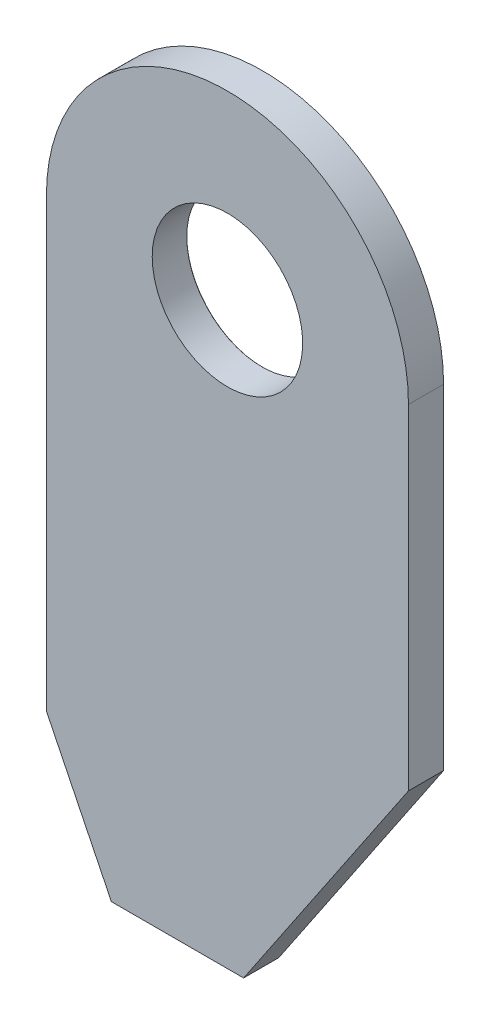
ISO-10303-21;
HEADER;
FILE_DESCRIPTION(('STEP AP214'),'2;1');
FILE_NAME('part.step','',(''),(''),'','','');
FILE_SCHEMA(('AUTOMOTIVE_DESIGN { 1 0 10303 214 1 1 1 1 }'));
ENDSEC;
DATA;
#1=APPLICATION_CONTEXT('core data for automotive mechanical design processes');
#2=APPLICATION_PROTOCOL_DEFINITION('international standard','automotive_design',2000,#1);
#3=PRODUCT_CONTEXT('',#1,'mechanical');
#4=PRODUCT('Part','Part','',(#3));
#5=PRODUCT_RELATED_PRODUCT_CATEGORY('part','',(#4));
#6=PRODUCT_DEFINITION_FORMATION('','',#4);
#7=PRODUCT_DEFINITION_CONTEXT('part definition',#1,'design');
#8=PRODUCT_DEFINITION('design','',#6,#7);
#9=PRODUCT_DEFINITION_SHAPE('','',#8);
#10=(LENGTH_UNIT() NAMED_UNIT(*) SI_UNIT(.MILLI.,.METRE.));
#11=(NAMED_UNIT(*) PLANE_ANGLE_UNIT() SI_UNIT($,.RADIAN.));
#12=(NAMED_UNIT(*) SI_UNIT($,.STERADIAN.) SOLID_ANGLE_UNIT());
#13=UNCERTAINTY_MEASURE_WITH_UNIT(LENGTH_MEASURE(1.E-05),#10,'distance_accuracy_value','');
#14=(GEOMETRIC_REPRESENTATION_CONTEXT(3) GLOBAL_UNCERTAINTY_ASSIGNED_CONTEXT((#13)) GLOBAL_UNIT_ASSIGNED_CONTEXT((#10,
#11,#12)) REPRESENTATION_CONTEXT('',''));
#15=CARTESIAN_POINT('',(0.,0.,0.));
#16=DIRECTION('',(0.,0.,1.));
#17=DIRECTION('',(1.,0.,0.));
#18=AXIS2_PLACEMENT_3D('',#15,#16,#17);
#19=CARTESIAN_POINT('',(0.,0.,0.));
#20=DIRECTION('',(0.,0.,1.));
#21=DIRECTION('',(1.,0.,0.));
#22=AXIS2_PLACEMENT_3D('',#19,#20,#21);
#23=PLANE('',#22);
#24=DIRECTION('',(0.,-1.,0.));
#25=VECTOR('',#24,1.);
#26=CARTESIAN_POINT('',(-7.939999995,0.,0.));
#27=LINE('',#26,#25);
#28=CARTESIAN_POINT('',(-7.939999995,0.,0.));
#29=VERTEX_POINT('',#28);
#30=CARTESIAN_POINT('',(-7.939999995,-19.583493140527,0.));
#31=VERTEX_POINT('',#30);
#32=EDGE_CURVE('E146',#29,#31,#27,.T.);
#33=ORIENTED_EDGE('',*,*,#32,.F.);
#34=CARTESIAN_POINT('',(0.,0.,0.));
#35=DIRECTION('',(0.,0.,1.));
#36=DIRECTION('',(1.,0.,0.));
#37=AXIS2_PLACEMENT_3D('',#34,#35,#36);
#38=CIRCLE('',#37,7.939999995);
#39=CARTESIAN_POINT('',(7.939999995,0.,0.));
#40=VERTEX_POINT('',#39);
#41=EDGE_CURVE('E66',#40,#29,#38,.T.);
#42=ORIENTED_EDGE('',*,*,#41,.F.);
#43=DIRECTION('',(0.,1.,0.));
#44=VECTOR('',#43,1.);
#45=CARTESIAN_POINT('',(7.939999995,0.,0.));
#46=LINE('',#45,#44);
#47=CARTESIAN_POINT('',(7.939999995,-14.6769288718079,0.));
#48=VERTEX_POINT('',#47);
#49=EDGE_CURVE('E156',#48,#40,#46,.T.);
#50=ORIENTED_EDGE('',*,*,#49,.F.);
#51=DIRECTION('',(-0.559069954709728,-0.829120489278164,0.));
#52=VECTOR('',#51,1.);
#53=CARTESIAN_POINT('',(12.2615699382193,-8.26788800744568,0.));
#54=LINE('',#53,#52);
#55=CARTESIAN_POINT('',(0.709510617989476,-25.4,0.));
#56=VERTEX_POINT('',#55);
#57=EDGE_CURVE('E154',#48,#56,#54,.T.);
#58=ORIENTED_EDGE('',*,*,#57,.T.);
#59=DIRECTION('',(1.,0.,0.));
#60=VECTOR('',#59,1.);
#61=CARTESIAN_POINT('',(0.,-25.4,0.));
#62=LINE('',#61,#60);
#63=CARTESIAN_POINT('',(-5.09037195500004,-25.4,0.));
#64=VERTEX_POINT('',#63);
#65=EDGE_CURVE('E134',#64,#56,#62,.T.);
#66=ORIENTED_EDGE('',*,*,#65,.F.);
#67=DIRECTION('',(-0.439957937300818,0.898018381441054,0.));
#68=VECTOR('',#67,1.);
#69=CARTESIAN_POINT('',(-14.1403583513444,-6.92765651741865,0.));
#70=LINE('',#69,#68);
#71=EDGE_CURVE('E149',#64,#31,#70,.T.);
#72=ORIENTED_EDGE('',*,*,#71,.T.);
#73=EDGE_LOOP('',(#33,#42,#50,#58,#66,#72));
#74=FACE_BOUND('',#73,.T.);
#75=CARTESIAN_POINT('',(0.,0.,0.));
#76=DIRECTION('',(0.,0.,-1.));
#77=DIRECTION('',(-1.,0.,0.));
#78=AXIS2_PLACEMENT_3D('',#75,#76,#77);
#79=CIRCLE('',#78,3.325);
#80=CARTESIAN_POINT('',(-3.325,0.,0.));
#81=VERTEX_POINT('',#80);
#82=EDGE_CURVE('E171',#81,#81,#79,.T.);
#83=ORIENTED_EDGE('',*,*,#82,.F.);
#84=EDGE_LOOP('',(#83));
#85=FACE_BOUND('',#84,.T.);
#86=ADVANCED_FACE('F62',(#74,#85),#23,.F.);
#87=CARTESIAN_POINT('',(-7.939999995,0.,1.54));
#88=DIRECTION('',(1.,0.,0.));
#89=DIRECTION('',(0.,0.,-1.));
#90=AXIS2_PLACEMENT_3D('',#87,#88,#89);
#91=PLANE('',#90);
#92=ORIENTED_EDGE('',*,*,#32,.T.);
#93=DIRECTION('',(0.,0.,-1.));
#94=VECTOR('',#93,1.);
#95=CARTESIAN_POINT('',(-7.939999995,-19.583493140527,1.54));
#96=LINE('',#95,#94);
#97=CARTESIAN_POINT('',(-7.939999995,-19.583493140527,1.54));
#98=VERTEX_POINT('',#97);
#99=EDGE_CURVE('E72',#98,#31,#96,.T.);
#100=ORIENTED_EDGE('',*,*,#99,.F.);
#101=DIRECTION('',(0.,-1.,0.));
#102=VECTOR('',#101,1.);
#103=CARTESIAN_POINT('',(-7.939999995,0.,1.54));
#104=LINE('',#103,#102);
#105=CARTESIAN_POINT('',(-7.939999995,0.,1.54));
#106=VERTEX_POINT('',#105);
#107=EDGE_CURVE('E158',#106,#98,#104,.T.);
#108=ORIENTED_EDGE('',*,*,#107,.F.);
#109=DIRECTION('',(0.,0.,-1.));
#110=VECTOR('',#109,1.);
#111=CARTESIAN_POINT('',(-7.939999995,0.,1.54));
#112=LINE('',#111,#110);
#113=EDGE_CURVE('E12',#106,#29,#112,.T.);
#114=ORIENTED_EDGE('',*,*,#113,.T.);
#115=EDGE_LOOP('',(#92,#100,#108,#114));
#116=FACE_BOUND('',#115,.T.);
#117=ADVANCED_FACE('F193',(#116),#91,.F.);
#118=CARTESIAN_POINT('',(-14.1403583513444,-6.92765651741865,1.54));
#119=DIRECTION('',(-0.898018381441054,-0.439957937300818,0.));
#120=DIRECTION('',(0.439957937300818,-0.898018381441054,0.));
#121=AXIS2_PLACEMENT_3D('',#118,#119,#120);
#122=PLANE('',#121);
#123=ORIENTED_EDGE('',*,*,#71,.F.);
#124=DIRECTION('',(0.,0.,-1.));
#125=VECTOR('',#124,1.);
#126=CARTESIAN_POINT('',(-5.09037195500004,-25.4,1.54));
#127=LINE('',#126,#125);
#128=CARTESIAN_POINT('',(-5.09037195500004,-25.4,1.54));
#129=VERTEX_POINT('',#128);
#130=EDGE_CURVE('E138',#129,#64,#127,.T.);
#131=ORIENTED_EDGE('',*,*,#130,.F.);
#132=DIRECTION('',(-0.439957937300818,0.898018381441054,0.));
#133=VECTOR('',#132,1.);
#134=CARTESIAN_POINT('',(-14.1403583513444,-6.92765651741865,1.54));
#135=LINE('',#134,#133);
#136=EDGE_CURVE('E127',#129,#98,#135,.T.);
#137=ORIENTED_EDGE('',*,*,#136,.T.);
#138=ORIENTED_EDGE('',*,*,#99,.T.);
#139=EDGE_LOOP('',(#123,#131,#137,#138));
#140=FACE_BOUND('',#139,.T.);
#141=ADVANCED_FACE('F177',(#140),#122,.T.);
#142=CARTESIAN_POINT('',(0.,-25.4,1.54));
#143=DIRECTION('',(0.,1.,0.));
#144=DIRECTION('',(0.,0.,1.));
#145=AXIS2_PLACEMENT_3D('',#142,#143,#144);
#146=PLANE('',#145);
#147=ORIENTED_EDGE('',*,*,#65,.T.);
#148=DIRECTION('',(0.,0.,-1.));
#149=VECTOR('',#148,1.);
#150=CARTESIAN_POINT('',(0.709510617989476,-25.4,1.54));
#151=LINE('',#150,#149);
#152=CARTESIAN_POINT('',(0.709510617989476,-25.4,1.54));
#153=VERTEX_POINT('',#152);
#154=EDGE_CURVE('E131',#153,#56,#151,.T.);
#155=ORIENTED_EDGE('',*,*,#154,.F.);
#156=DIRECTION('',(1.,0.,0.));
#157=VECTOR('',#156,1.);
#158=CARTESIAN_POINT('',(0.,-25.4,1.54));
#159=LINE('',#158,#157);
#160=EDGE_CURVE('E120',#129,#153,#159,.T.);
#161=ORIENTED_EDGE('',*,*,#160,.F.);
#162=ORIENTED_EDGE('',*,*,#130,.T.);
#163=EDGE_LOOP('',(#147,#155,#161,#162));
#164=FACE_BOUND('',#163,.T.);
#165=ADVANCED_FACE('F132',(#164),#146,.F.);
#166=CARTESIAN_POINT('',(12.2615699382193,-8.26788800744568,1.54));
#167=DIRECTION('',(0.829120489278164,-0.559069954709728,0.));
#168=DIRECTION('',(0.559069954709728,0.829120489278164,0.));
#169=AXIS2_PLACEMENT_3D('',#166,#167,#168);
#170=PLANE('',#169);
#171=ORIENTED_EDGE('',*,*,#57,.F.);
#172=DIRECTION('',(0.,0.,-1.));
#173=VECTOR('',#172,1.);
#174=CARTESIAN_POINT('',(7.939999995,-14.6769288718079,1.54));
#175=LINE('',#174,#173);
#176=CARTESIAN_POINT('',(7.939999995,-14.6769288718079,1.54));
#177=VERTEX_POINT('',#176);
#178=EDGE_CURVE('E100',#177,#48,#175,.T.);
#179=ORIENTED_EDGE('',*,*,#178,.F.);
#180=DIRECTION('',(-0.559069954709728,-0.829120489278164,0.));
#181=VECTOR('',#180,1.);
#182=CARTESIAN_POINT('',(12.2615699382193,-8.26788800744568,1.54));
#183=LINE('',#182,#181);
#184=EDGE_CURVE('E125',#177,#153,#183,.T.);
#185=ORIENTED_EDGE('',*,*,#184,.T.);
#186=ORIENTED_EDGE('',*,*,#154,.T.);
#187=EDGE_LOOP('',(#171,#179,#185,#186));
#188=FACE_BOUND('',#187,.T.);
#189=ADVANCED_FACE('F140',(#188),#170,.T.);
#190=CARTESIAN_POINT('',(7.939999995,0.,1.54));
#191=DIRECTION('',(-1.,0.,0.));
#192=DIRECTION('',(0.,0.,1.));
#193=AXIS2_PLACEMENT_3D('',#190,#191,#192);
#194=PLANE('',#193);
#195=ORIENTED_EDGE('',*,*,#49,.T.);
#196=DIRECTION('',(0.,0.,-1.));
#197=VECTOR('',#196,1.);
#198=CARTESIAN_POINT('',(7.939999995,0.,1.54));
#199=LINE('',#198,#197);
#200=CARTESIAN_POINT('',(7.939999995,0.,1.54));
#201=VERTEX_POINT('',#200);
#202=EDGE_CURVE('E81',#201,#40,#199,.T.);
#203=ORIENTED_EDGE('',*,*,#202,.F.);
#204=DIRECTION('',(0.,1.,0.));
#205=VECTOR('',#204,1.);
#206=CARTESIAN_POINT('',(7.939999995,0.,1.54));
#207=LINE('',#206,#205);
#208=EDGE_CURVE('E141',#177,#201,#207,.T.);
#209=ORIENTED_EDGE('',*,*,#208,.F.);
#210=ORIENTED_EDGE('',*,*,#178,.T.);
#211=EDGE_LOOP('',(#195,#203,#209,#210));
#212=FACE_BOUND('',#211,.T.);
#213=ADVANCED_FACE('F181',(#212),#194,.F.);
#214=CARTESIAN_POINT('',(0.,0.,1.54));
#215=DIRECTION('',(0.,0.,1.));
#216=DIRECTION('',(1.,0.,0.));
#217=AXIS2_PLACEMENT_3D('',#214,#215,#216);
#218=PLANE('',#217);
#219=CARTESIAN_POINT('',(0.,0.,1.54));
#220=DIRECTION('',(0.,0.,-1.));
#221=DIRECTION('',(-1.,0.,0.));
#222=AXIS2_PLACEMENT_3D('',#219,#220,#221);
#223=CIRCLE('',#222,3.3);
#224=CARTESIAN_POINT('',(-3.3,0.,1.54));
#225=VERTEX_POINT('',#224);
#226=EDGE_CURVE('E163',#225,#225,#223,.T.);
#227=ORIENTED_EDGE('',*,*,#226,.T.);
#228=EDGE_LOOP('',(#227));
#229=FACE_BOUND('',#228,.T.);
#230=ORIENTED_EDGE('',*,*,#208,.T.);
#231=CARTESIAN_POINT('',(0.,0.,1.54));
#232=DIRECTION('',(0.,0.,1.));
#233=DIRECTION('',(1.,0.,0.));
#234=AXIS2_PLACEMENT_3D('',#231,#232,#233);
#235=CIRCLE('',#234,7.939999995);
#236=EDGE_CURVE('E150',#201,#106,#235,.T.);
#237=ORIENTED_EDGE('',*,*,#236,.T.);
#238=ORIENTED_EDGE('',*,*,#107,.T.);
#239=ORIENTED_EDGE('',*,*,#136,.F.);
#240=ORIENTED_EDGE('',*,*,#160,.T.);
#241=ORIENTED_EDGE('',*,*,#184,.F.);
#242=EDGE_LOOP('',(#230,#237,#238,#239,#240,#241));
#243=FACE_BOUND('',#242,.T.);
#244=ADVANCED_FACE('F123',(#229,#243),#218,.T.);
#245=CARTESIAN_POINT('',(0.,0.,1.54));
#246=DIRECTION('',(0.,0.,-1.));
#247=DIRECTION('',(-1.,0.,0.));
#248=AXIS2_PLACEMENT_3D('',#245,#246,#247);
#249=CYLINDRICAL_SURFACE('',#248,7.939999995);
#250=ORIENTED_EDGE('',*,*,#41,.T.);
#251=ORIENTED_EDGE('',*,*,#113,.F.);
#252=ORIENTED_EDGE('',*,*,#236,.F.);
#253=ORIENTED_EDGE('',*,*,#202,.T.);
#254=EDGE_LOOP('',(#250,#251,#252,#253));
#255=FACE_BOUND('',#254,.T.);
#256=ADVANCED_FACE('F64',(#255),#249,.T.);
#257=CARTESIAN_POINT('',(0.,0.,0.));
#258=DIRECTION('',(0.,0.,-1.));
#259=DIRECTION('',(-1.,0.,0.));
#260=AXIS2_PLACEMENT_3D('',#257,#258,#259);
#261=CYLINDRICAL_SURFACE('',#260,3.29999999999999);
#262=ORIENTED_EDGE('',*,*,#226,.F.);
#263=EDGE_LOOP('',(#262));
#264=FACE_BOUND('',#263,.T.);
#265=CARTESIAN_POINT('',(0.,0.,0.0249999999999972));
#266=DIRECTION('',(0.,0.,-1.));
#267=DIRECTION('',(-1.,0.,0.));
#268=AXIS2_PLACEMENT_3D('',#265,#266,#267);
#269=CIRCLE('',#268,3.29999999999999);
#270=CARTESIAN_POINT('',(-3.29999999999999,0.,0.0249999999999972));
#271=VERTEX_POINT('',#270);
#272=EDGE_CURVE('E166',#271,#271,#269,.T.);
#273=ORIENTED_EDGE('',*,*,#272,.T.);
#274=EDGE_LOOP('',(#273));
#275=FACE_BOUND('',#274,.T.);
#276=ADVANCED_FACE('F199',(#264,#275),#261,.F.);
#277=CARTESIAN_POINT('',(0.,0.,0.));
#278=DIRECTION('',(0.,0.,-1.));
#279=DIRECTION('',(-1.,0.,0.));
#280=AXIS2_PLACEMENT_3D('',#277,#278,#279);
#281=CONICAL_SURFACE('',#280,3.325,0.785398163397726);
#282=ORIENTED_EDGE('',*,*,#272,.F.);
#283=EDGE_LOOP('',(#282));
#284=FACE_BOUND('',#283,.T.);
#285=ORIENTED_EDGE('',*,*,#82,.T.);
#286=EDGE_LOOP('',(#285));
#287=FACE_BOUND('',#286,.T.);
#288=ADVANCED_FACE('F202',(#284,#287),#281,.F.);
#289=CLOSED_SHELL('',(#86,#117,#141,#165,#189,#213,#244,#256,#276,#288));
#290=MANIFOLD_SOLID_BREP('B2',#289);
#291=ADVANCED_BREP_SHAPE_REPRESENTATION('',(#18,#290),#14);
#292=SHAPE_DEFINITION_REPRESENTATION(#9,#291);
ENDSEC;
END-ISO-10303-21;
